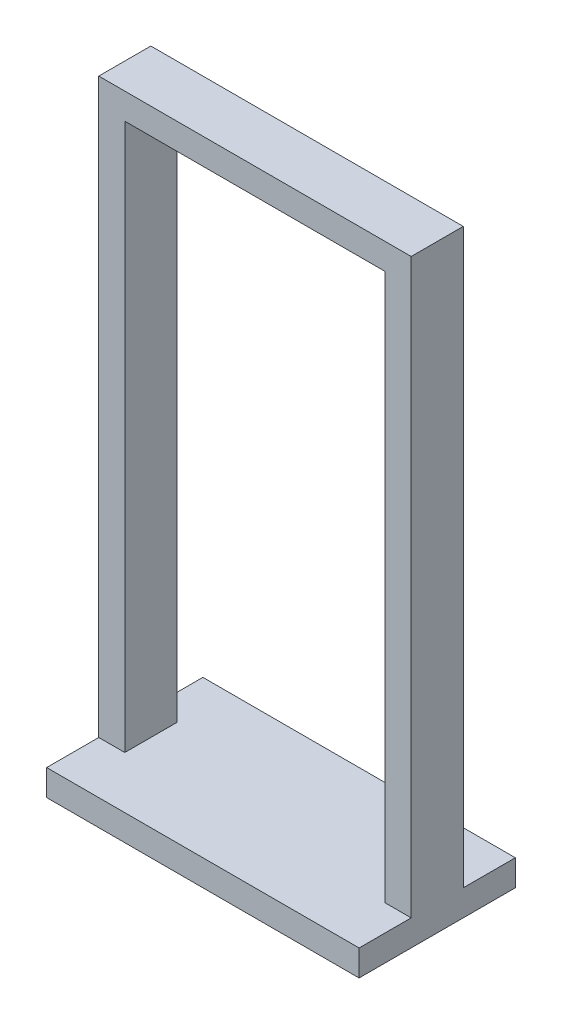
ISO-10303-21;
HEADER;
FILE_DESCRIPTION(('STEP AP214'),'2;1');
FILE_NAME('part.step','',(''),(''),'','','');
FILE_SCHEMA(('AUTOMOTIVE_DESIGN { 1 0 10303 214 1 1 1 1 }'));
ENDSEC;
DATA;
#1=APPLICATION_CONTEXT('core data for automotive mechanical design processes');
#2=APPLICATION_PROTOCOL_DEFINITION('international standard','automotive_design',2000,#1);
#3=PRODUCT_CONTEXT('',#1,'mechanical');
#4=PRODUCT('Part','Part','',(#3));
#5=PRODUCT_RELATED_PRODUCT_CATEGORY('part','',(#4));
#6=PRODUCT_DEFINITION_FORMATION('','',#4);
#7=PRODUCT_DEFINITION_CONTEXT('part definition',#1,'design');
#8=PRODUCT_DEFINITION('design','',#6,#7);
#9=PRODUCT_DEFINITION_SHAPE('','',#8);
#10=(LENGTH_UNIT() NAMED_UNIT(*) SI_UNIT(.MILLI.,.METRE.));
#11=(NAMED_UNIT(*) PLANE_ANGLE_UNIT() SI_UNIT($,.RADIAN.));
#12=(NAMED_UNIT(*) SI_UNIT($,.STERADIAN.) SOLID_ANGLE_UNIT());
#13=UNCERTAINTY_MEASURE_WITH_UNIT(LENGTH_MEASURE(1.E-05),#10,'distance_accuracy_value','');
#14=(GEOMETRIC_REPRESENTATION_CONTEXT(3) GLOBAL_UNCERTAINTY_ASSIGNED_CONTEXT((#13)) GLOBAL_UNIT_ASSIGNED_CONTEXT((#10,
#11,#12)) REPRESENTATION_CONTEXT('',''));
#15=CARTESIAN_POINT('',(0.,0.,0.));
#16=DIRECTION('',(0.,0.,1.));
#17=DIRECTION('',(1.,0.,0.));
#18=AXIS2_PLACEMENT_3D('',#15,#16,#17);
#19=CARTESIAN_POINT('',(-500.,1050.,100.));
#20=DIRECTION('',(0.,-1.,0.));
#21=DIRECTION('',(0.,0.,-1.));
#22=AXIS2_PLACEMENT_3D('',#19,#20,#21);
#23=PLANE('',#22);
#24=DIRECTION('',(-1.,0.,0.));
#25=VECTOR('',#24,1.);
#26=CARTESIAN_POINT('',(-500.,1050.,-100.));
#27=LINE('',#26,#25);
#28=CARTESIAN_POINT('',(500.,1050.,-100.));
#29=VERTEX_POINT('',#28);
#30=CARTESIAN_POINT('',(-500.,1050.,-100.));
#31=VERTEX_POINT('',#30);
#32=EDGE_CURVE('E254',#29,#31,#27,.T.);
#33=ORIENTED_EDGE('',*,*,#32,.F.);
#34=DIRECTION('',(0.,0.,-1.));
#35=VECTOR('',#34,1.);
#36=CARTESIAN_POINT('',(500.,1050.,100.));
#37=LINE('',#36,#35);
#38=CARTESIAN_POINT('',(500.,1050.,100.));
#39=VERTEX_POINT('',#38);
#40=EDGE_CURVE('E266',#39,#29,#37,.T.);
#41=ORIENTED_EDGE('',*,*,#40,.F.);
#42=DIRECTION('',(-1.,0.,0.));
#43=VECTOR('',#42,1.);
#44=CARTESIAN_POINT('',(-500.,1050.,100.));
#45=LINE('',#44,#43);
#46=CARTESIAN_POINT('',(-500.,1050.,100.));
#47=VERTEX_POINT('',#46);
#48=EDGE_CURVE('E244',#39,#47,#45,.T.);
#49=ORIENTED_EDGE('',*,*,#48,.T.);
#50=DIRECTION('',(0.,0.,-1.));
#51=VECTOR('',#50,1.);
#52=CARTESIAN_POINT('',(-500.,1050.,100.));
#53=LINE('',#52,#51);
#54=EDGE_CURVE('E264',#47,#31,#53,.T.);
#55=ORIENTED_EDGE('',*,*,#54,.T.);
#56=EDGE_LOOP('',(#33,#41,#49,#55));
#57=FACE_BOUND('',#56,.T.);
#58=DIRECTION('',(0.,0.,-1.));
#59=VECTOR('',#58,1.);
#60=CARTESIAN_POINT('',(285.,1050.,82.5));
#61=LINE('',#60,#59);
#62=CARTESIAN_POINT('',(285.,1050.,82.5));
#63=VERTEX_POINT('',#62);
#64=CARTESIAN_POINT('',(285.,1050.,65.5));
#65=VERTEX_POINT('',#64);
#66=EDGE_CURVE('E195',#63,#65,#61,.T.);
#67=ORIENTED_EDGE('',*,*,#66,.F.);
#68=DIRECTION('',(1.,0.,0.));
#69=VECTOR('',#68,1.);
#70=CARTESIAN_POINT('',(285.,1050.,82.5));
#71=LINE('',#70,#69);
#72=CARTESIAN_POINT('',(355.,1050.,82.5));
#73=VERTEX_POINT('',#72);
#74=EDGE_CURVE('E80',#63,#73,#71,.T.);
#75=ORIENTED_EDGE('',*,*,#74,.T.);
#76=DIRECTION('',(0.,0.,-1.));
#77=VECTOR('',#76,1.);
#78=CARTESIAN_POINT('',(355.,1050.,82.5));
#79=LINE('',#78,#77);
#80=CARTESIAN_POINT('',(355.,1050.,65.5));
#81=VERTEX_POINT('',#80);
#82=EDGE_CURVE('E199',#73,#81,#79,.T.);
#83=ORIENTED_EDGE('',*,*,#82,.T.);
#84=DIRECTION('',(1.,0.,0.));
#85=VECTOR('',#84,1.);
#86=CARTESIAN_POINT('',(285.,1050.,65.5));
#87=LINE('',#86,#85);
#88=EDGE_CURVE('E521',#65,#81,#87,.T.);
#89=ORIENTED_EDGE('',*,*,#88,.F.);
#90=EDGE_LOOP('',(#67,#75,#83,#89));
#91=FACE_BOUND('',#90,.T.);
#92=ADVANCED_FACE('F65',(#57,#91),#23,.T.);
#93=CARTESIAN_POINT('',(0.,0.,100.));
#94=DIRECTION('',(0.,0.,1.));
#95=DIRECTION('',(1.,0.,0.));
#96=AXIS2_PLACEMENT_3D('',#93,#94,#95);
#97=PLANE('',#96);
#98=DIRECTION('',(-1.,0.,0.));
#99=VECTOR('',#98,1.);
#100=CARTESIAN_POINT('',(1.94289029309402E-13,-1050.,100.));
#101=LINE('',#100,#99);
#102=CARTESIAN_POINT('',(600.,-1050.,100.));
#103=VERTEX_POINT('',#102);
#104=CARTESIAN_POINT('',(500.,-1050.,100.));
#105=VERTEX_POINT('',#104);
#106=EDGE_CURVE('E88',#103,#105,#101,.T.);
#107=ORIENTED_EDGE('',*,*,#106,.F.);
#108=DIRECTION('',(0.,1.,0.));
#109=VECTOR('',#108,1.);
#110=CARTESIAN_POINT('',(600.,0.,100.));
#111=LINE('',#110,#109);
#112=CARTESIAN_POINT('',(600.,1150.,100.));
#113=VERTEX_POINT('',#112);
#114=EDGE_CURVE('E270',#103,#113,#111,.T.);
#115=ORIENTED_EDGE('',*,*,#114,.T.);
#116=DIRECTION('',(-1.,0.,0.));
#117=VECTOR('',#116,1.);
#118=CARTESIAN_POINT('',(0.,1150.,100.));
#119=LINE('',#118,#117);
#120=CARTESIAN_POINT('',(-600.,1150.,100.));
#121=VERTEX_POINT('',#120);
#122=EDGE_CURVE('E272',#113,#121,#119,.T.);
#123=ORIENTED_EDGE('',*,*,#122,.T.);
#124=DIRECTION('',(0.,-1.,0.));
#125=VECTOR('',#124,1.);
#126=CARTESIAN_POINT('',(-600.,0.,100.));
#127=LINE('',#126,#125);
#128=CARTESIAN_POINT('',(-600.,-1050.,100.));
#129=VERTEX_POINT('',#128);
#130=EDGE_CURVE('E275',#121,#129,#127,.T.);
#131=ORIENTED_EDGE('',*,*,#130,.T.);
#132=CARTESIAN_POINT('',(-500.,-1050.,100.));
#133=VERTEX_POINT('',#132);
#134=EDGE_CURVE('E238',#133,#129,#101,.T.);
#135=ORIENTED_EDGE('',*,*,#134,.F.);
#136=DIRECTION('',(0.,-1.,0.));
#137=VECTOR('',#136,1.);
#138=CARTESIAN_POINT('',(-500.,-1050.,100.));
#139=LINE('',#138,#137);
#140=EDGE_CURVE('E247',#47,#133,#139,.T.);
#141=ORIENTED_EDGE('',*,*,#140,.F.);
#142=ORIENTED_EDGE('',*,*,#48,.F.);
#143=DIRECTION('',(0.,1.,0.));
#144=VECTOR('',#143,1.);
#145=CARTESIAN_POINT('',(500.,-1050.,100.));
#146=LINE('',#145,#144);
#147=EDGE_CURVE('E242',#105,#39,#146,.T.);
#148=ORIENTED_EDGE('',*,*,#147,.F.);
#149=EDGE_LOOP('',(#107,#115,#123,#131,#135,#141,#142,#148));
#150=FACE_BOUND('',#149,.T.);
#151=ADVANCED_FACE('F309',(#150),#97,.T.);
#152=CARTESIAN_POINT('',(0.,0.,-100.));
#153=DIRECTION('',(0.,0.,1.));
#154=DIRECTION('',(1.,0.,0.));
#155=AXIS2_PLACEMENT_3D('',#152,#153,#154);
#156=PLANE('',#155);
#157=DIRECTION('',(0.,1.,0.));
#158=VECTOR('',#157,1.);
#159=CARTESIAN_POINT('',(600.,0.,-100.));
#160=LINE('',#159,#158);
#161=CARTESIAN_POINT('',(600.,-1050.,-100.));
#162=VERTEX_POINT('',#161);
#163=CARTESIAN_POINT('',(600.,1150.,-100.));
#164=VERTEX_POINT('',#163);
#165=EDGE_CURVE('E269',#162,#164,#160,.T.);
#166=ORIENTED_EDGE('',*,*,#165,.F.);
#167=DIRECTION('',(-1.,0.,0.));
#168=VECTOR('',#167,1.);
#169=CARTESIAN_POINT('',(1.94289029309402E-13,-1050.,-100.));
#170=LINE('',#169,#168);
#171=CARTESIAN_POINT('',(500.,-1050.,-100.));
#172=VERTEX_POINT('',#171);
#173=EDGE_CURVE('E239',#162,#172,#170,.T.);
#174=ORIENTED_EDGE('',*,*,#173,.T.);
#175=DIRECTION('',(0.,1.,0.));
#176=VECTOR('',#175,1.);
#177=CARTESIAN_POINT('',(500.,-1050.,-100.));
#178=LINE('',#177,#176);
#179=EDGE_CURVE('E251',#172,#29,#178,.T.);
#180=ORIENTED_EDGE('',*,*,#179,.T.);
#181=ORIENTED_EDGE('',*,*,#32,.T.);
#182=DIRECTION('',(0.,-1.,0.));
#183=VECTOR('',#182,1.);
#184=CARTESIAN_POINT('',(-500.,-1050.,-100.));
#185=LINE('',#184,#183);
#186=CARTESIAN_POINT('',(-500.,-1050.,-100.));
#187=VERTEX_POINT('',#186);
#188=EDGE_CURVE('E245',#31,#187,#185,.T.);
#189=ORIENTED_EDGE('',*,*,#188,.T.);
#190=CARTESIAN_POINT('',(-600.,-1050.,-100.));
#191=VERTEX_POINT('',#190);
#192=EDGE_CURVE('E235',#187,#191,#170,.T.);
#193=ORIENTED_EDGE('',*,*,#192,.T.);
#194=DIRECTION('',(0.,-1.,0.));
#195=VECTOR('',#194,1.);
#196=CARTESIAN_POINT('',(-600.,0.,-100.));
#197=LINE('',#196,#195);
#198=CARTESIAN_POINT('',(-600.,1150.,-100.));
#199=VERTEX_POINT('',#198);
#200=EDGE_CURVE('E273',#199,#191,#197,.T.);
#201=ORIENTED_EDGE('',*,*,#200,.F.);
#202=DIRECTION('',(-1.,0.,0.));
#203=VECTOR('',#202,1.);
#204=CARTESIAN_POINT('',(0.,1150.,-100.));
#205=LINE('',#204,#203);
#206=EDGE_CURVE('E279',#164,#199,#205,.T.);
#207=ORIENTED_EDGE('',*,*,#206,.F.);
#208=EDGE_LOOP('',(#166,#174,#180,#181,#189,#193,#201,#207));
#209=FACE_BOUND('',#208,.T.);
#210=ADVANCED_FACE('F298',(#209),#156,.F.);
#211=CARTESIAN_POINT('',(600.,0.,100.));
#212=DIRECTION('',(-1.,0.,0.));
#213=DIRECTION('',(0.,0.,1.));
#214=AXIS2_PLACEMENT_3D('',#211,#212,#213);
#215=PLANE('',#214);
#216=ORIENTED_EDGE('',*,*,#114,.F.);
#217=DIRECTION('',(0.,0.,1.));
#218=VECTOR('',#217,1.);
#219=CARTESIAN_POINT('',(600.,-1050.,-1704.15945787923));
#220=LINE('',#219,#218);
#221=CARTESIAN_POINT('',(600.,-1050.,300.));
#222=VERTEX_POINT('',#221);
#223=EDGE_CURVE('E218',#103,#222,#220,.T.);
#224=ORIENTED_EDGE('',*,*,#223,.T.);
#225=DIRECTION('',(0.,1.,0.));
#226=VECTOR('',#225,1.);
#227=CARTESIAN_POINT('',(600.,-1150.,300.));
#228=LINE('',#227,#226);
#229=CARTESIAN_POINT('',(600.,-1150.,300.));
#230=VERTEX_POINT('',#229);
#231=EDGE_CURVE('E212',#230,#222,#228,.T.);
#232=ORIENTED_EDGE('',*,*,#231,.F.);
#233=DIRECTION('',(0.,0.,-1.));
#234=VECTOR('',#233,1.);
#235=CARTESIAN_POINT('',(600.,-1150.,100.));
#236=LINE('',#235,#234);
#237=CARTESIAN_POINT('',(600.,-1150.,-300.));
#238=VERTEX_POINT('',#237);
#239=EDGE_CURVE('E277',#230,#238,#236,.T.);
#240=ORIENTED_EDGE('',*,*,#239,.T.);
#241=DIRECTION('',(0.,-1.,0.));
#242=VECTOR('',#241,1.);
#243=CARTESIAN_POINT('',(600.,-1150.,-300.));
#244=LINE('',#243,#242);
#245=CARTESIAN_POINT('',(600.,-1050.,-300.));
#246=VERTEX_POINT('',#245);
#247=EDGE_CURVE('E219',#246,#238,#244,.T.);
#248=ORIENTED_EDGE('',*,*,#247,.F.);
#249=EDGE_CURVE('E230',#246,#162,#220,.T.);
#250=ORIENTED_EDGE('',*,*,#249,.T.);
#251=ORIENTED_EDGE('',*,*,#165,.T.);
#252=DIRECTION('',(0.,0.,-1.));
#253=VECTOR('',#252,1.);
#254=CARTESIAN_POINT('',(600.,1150.,100.));
#255=LINE('',#254,#253);
#256=EDGE_CURVE('E13',#113,#164,#255,.T.);
#257=ORIENTED_EDGE('',*,*,#256,.F.);
#258=EDGE_LOOP('',(#216,#224,#232,#240,#248,#250,#251,#257));
#259=FACE_BOUND('',#258,.T.);
#260=ADVANCED_FACE('F67',(#259),#215,.F.);
#261=CARTESIAN_POINT('',(0.,1150.,100.));
#262=DIRECTION('',(0.,-1.,0.));
#263=DIRECTION('',(0.,0.,-1.));
#264=AXIS2_PLACEMENT_3D('',#261,#262,#263);
#265=PLANE('',#264);
#266=ORIENTED_EDGE('',*,*,#206,.T.);
#267=DIRECTION('',(0.,0.,-1.));
#268=VECTOR('',#267,1.);
#269=CARTESIAN_POINT('',(-600.,1150.,100.));
#270=LINE('',#269,#268);
#271=EDGE_CURVE('E73',#121,#199,#270,.T.);
#272=ORIENTED_EDGE('',*,*,#271,.F.);
#273=ORIENTED_EDGE('',*,*,#122,.F.);
#274=ORIENTED_EDGE('',*,*,#256,.T.);
#275=EDGE_LOOP('',(#266,#272,#273,#274));
#276=FACE_BOUND('',#275,.T.);
#277=ADVANCED_FACE('F320',(#276),#265,.F.);
#278=CARTESIAN_POINT('',(-600.,0.,100.));
#279=DIRECTION('',(1.,0.,0.));
#280=DIRECTION('',(0.,0.,-1.));
#281=AXIS2_PLACEMENT_3D('',#278,#279,#280);
#282=PLANE('',#281);
#283=ORIENTED_EDGE('',*,*,#200,.T.);
#284=DIRECTION('',(0.,0.,1.));
#285=VECTOR('',#284,1.);
#286=CARTESIAN_POINT('',(-600.,-1050.,-1704.15945787923));
#287=LINE('',#286,#285);
#288=CARTESIAN_POINT('',(-600.,-1050.,-300.));
#289=VERTEX_POINT('',#288);
#290=EDGE_CURVE('E223',#289,#191,#287,.T.);
#291=ORIENTED_EDGE('',*,*,#290,.F.);
#292=DIRECTION('',(0.,1.,0.));
#293=VECTOR('',#292,1.);
#294=CARTESIAN_POINT('',(-600.,-1150.,-300.));
#295=LINE('',#294,#293);
#296=CARTESIAN_POINT('',(-600.,-1150.,-300.));
#297=VERTEX_POINT('',#296);
#298=EDGE_CURVE('E225',#297,#289,#295,.T.);
#299=ORIENTED_EDGE('',*,*,#298,.F.);
#300=DIRECTION('',(0.,0.,-1.));
#301=VECTOR('',#300,1.);
#302=CARTESIAN_POINT('',(-600.,-1150.,100.));
#303=LINE('',#302,#301);
#304=CARTESIAN_POINT('',(-600.,-1150.,300.));
#305=VERTEX_POINT('',#304);
#306=EDGE_CURVE('E284',#305,#297,#303,.T.);
#307=ORIENTED_EDGE('',*,*,#306,.F.);
#308=DIRECTION('',(0.,-1.,0.));
#309=VECTOR('',#308,1.);
#310=CARTESIAN_POINT('',(-600.,-1150.,300.));
#311=LINE('',#310,#309);
#312=CARTESIAN_POINT('',(-600.,-1050.,300.));
#313=VERTEX_POINT('',#312);
#314=EDGE_CURVE('E200',#313,#305,#311,.T.);
#315=ORIENTED_EDGE('',*,*,#314,.F.);
#316=EDGE_CURVE('E229',#129,#313,#287,.T.);
#317=ORIENTED_EDGE('',*,*,#316,.F.);
#318=ORIENTED_EDGE('',*,*,#130,.F.);
#319=ORIENTED_EDGE('',*,*,#271,.T.);
#320=EDGE_LOOP('',(#283,#291,#299,#307,#315,#317,#318,#319));
#321=FACE_BOUND('',#320,.T.);
#322=ADVANCED_FACE('F290',(#321),#282,.F.);
#323=CARTESIAN_POINT('',(0.,-1150.,100.));
#324=DIRECTION('',(0.,1.,0.));
#325=DIRECTION('',(0.,0.,1.));
#326=AXIS2_PLACEMENT_3D('',#323,#324,#325);
#327=PLANE('',#326);
#328=ORIENTED_EDGE('',*,*,#306,.T.);
#329=DIRECTION('',(-1.,0.,0.));
#330=VECTOR('',#329,1.);
#331=CARTESIAN_POINT('',(-600.,-1150.,-300.));
#332=LINE('',#331,#330);
#333=EDGE_CURVE('E227',#238,#297,#332,.T.);
#334=ORIENTED_EDGE('',*,*,#333,.F.);
#335=ORIENTED_EDGE('',*,*,#239,.F.);
#336=DIRECTION('',(1.,0.,0.));
#337=VECTOR('',#336,1.);
#338=CARTESIAN_POINT('',(-600.,-1150.,300.));
#339=LINE('',#338,#337);
#340=EDGE_CURVE('E204',#305,#230,#339,.T.);
#341=ORIENTED_EDGE('',*,*,#340,.F.);
#342=EDGE_LOOP('',(#328,#334,#335,#341));
#343=FACE_BOUND('',#342,.T.);
#344=ADVANCED_FACE('F326',(#343),#327,.F.);
#345=CARTESIAN_POINT('',(500.,-1050.,100.));
#346=DIRECTION('',(-1.,0.,0.));
#347=DIRECTION('',(0.,0.,1.));
#348=AXIS2_PLACEMENT_3D('',#345,#346,#347);
#349=PLANE('',#348);
#350=ORIENTED_EDGE('',*,*,#179,.F.);
#351=DIRECTION('',(0.,0.,-1.));
#352=VECTOR('',#351,1.);
#353=CARTESIAN_POINT('',(500.,-1050.,100.));
#354=LINE('',#353,#352);
#355=EDGE_CURVE('E250',#105,#172,#354,.T.);
#356=ORIENTED_EDGE('',*,*,#355,.F.);
#357=ORIENTED_EDGE('',*,*,#147,.T.);
#358=ORIENTED_EDGE('',*,*,#40,.T.);
#359=EDGE_LOOP('',(#350,#356,#357,#358));
#360=FACE_BOUND('',#359,.T.);
#361=ADVANCED_FACE('F341',(#360),#349,.T.);
#362=CARTESIAN_POINT('',(-500.,-1050.,100.));
#363=DIRECTION('',(1.,0.,0.));
#364=DIRECTION('',(0.,0.,-1.));
#365=AXIS2_PLACEMENT_3D('',#362,#363,#364);
#366=PLANE('',#365);
#367=ORIENTED_EDGE('',*,*,#188,.F.);
#368=ORIENTED_EDGE('',*,*,#54,.F.);
#369=ORIENTED_EDGE('',*,*,#140,.T.);
#370=DIRECTION('',(0.,0.,-1.));
#371=VECTOR('',#370,1.);
#372=CARTESIAN_POINT('',(-500.,-1050.,100.));
#373=LINE('',#372,#371);
#374=EDGE_CURVE('E261',#133,#187,#373,.T.);
#375=ORIENTED_EDGE('',*,*,#374,.T.);
#376=EDGE_LOOP('',(#367,#368,#369,#375));
#377=FACE_BOUND('',#376,.T.);
#378=ADVANCED_FACE('F305',(#377),#366,.T.);
#379=CARTESIAN_POINT('',(-500.,-1050.,100.));
#380=DIRECTION('',(0.,1.,0.));
#381=DIRECTION('',(0.,0.,1.));
#382=AXIS2_PLACEMENT_3D('',#379,#380,#381);
#383=PLANE('',#382);
#384=ORIENTED_EDGE('',*,*,#355,.T.);
#385=ORIENTED_EDGE('',*,*,#173,.F.);
#386=ORIENTED_EDGE('',*,*,#249,.F.);
#387=DIRECTION('',(1.,0.,0.));
#388=VECTOR('',#387,1.);
#389=CARTESIAN_POINT('',(-600.,-1050.,-300.));
#390=LINE('',#389,#388);
#391=EDGE_CURVE('E222',#289,#246,#390,.T.);
#392=ORIENTED_EDGE('',*,*,#391,.F.);
#393=ORIENTED_EDGE('',*,*,#290,.T.);
#394=ORIENTED_EDGE('',*,*,#192,.F.);
#395=ORIENTED_EDGE('',*,*,#374,.F.);
#396=ORIENTED_EDGE('',*,*,#134,.T.);
#397=ORIENTED_EDGE('',*,*,#316,.T.);
#398=DIRECTION('',(-1.,0.,0.));
#399=VECTOR('',#398,1.);
#400=CARTESIAN_POINT('',(-600.,-1050.,300.));
#401=LINE('',#400,#399);
#402=EDGE_CURVE('E215',#222,#313,#401,.T.);
#403=ORIENTED_EDGE('',*,*,#402,.F.);
#404=ORIENTED_EDGE('',*,*,#223,.F.);
#405=ORIENTED_EDGE('',*,*,#106,.T.);
#406=EDGE_LOOP('',(#384,#385,#386,#392,#393,#394,#395,#396,#397,#403,#404,#405));
#407=FACE_BOUND('',#406,.T.);
#408=ADVANCED_FACE('F302',(#407),#383,.T.);
#409=CARTESIAN_POINT('',(0.,0.,-300.));
#410=DIRECTION('',(0.,0.,1.));
#411=DIRECTION('',(1.,0.,0.));
#412=AXIS2_PLACEMENT_3D('',#409,#410,#411);
#413=PLANE('',#412);
#414=ORIENTED_EDGE('',*,*,#298,.T.);
#415=ORIENTED_EDGE('',*,*,#391,.T.);
#416=ORIENTED_EDGE('',*,*,#247,.T.);
#417=ORIENTED_EDGE('',*,*,#333,.T.);
#418=EDGE_LOOP('',(#414,#415,#416,#417));
#419=FACE_BOUND('',#418,.T.);
#420=ADVANCED_FACE('F353',(#419),#413,.F.);
#421=CARTESIAN_POINT('',(0.,0.,300.));
#422=DIRECTION('',(0.,0.,-1.));
#423=DIRECTION('',(-1.,0.,0.));
#424=AXIS2_PLACEMENT_3D('',#421,#422,#423);
#425=PLANE('',#424);
#426=ORIENTED_EDGE('',*,*,#314,.T.);
#427=ORIENTED_EDGE('',*,*,#340,.T.);
#428=ORIENTED_EDGE('',*,*,#231,.T.);
#429=ORIENTED_EDGE('',*,*,#402,.T.);
#430=EDGE_LOOP('',(#426,#427,#428,#429));
#431=FACE_BOUND('',#430,.T.);
#432=ADVANCED_FACE('F315',(#431),#425,.F.);
#433=CARTESIAN_POINT('',(285.,1080.,82.5));
#434=DIRECTION('',(0.,0.,-1.));
#435=DIRECTION('',(-1.,0.,0.));
#436=AXIS2_PLACEMENT_3D('',#433,#434,#435);
#437=PLANE('',#436);
#438=ORIENTED_EDGE('',*,*,#74,.F.);
#439=DIRECTION('',(0.,-1.,0.));
#440=VECTOR('',#439,1.);
#441=CARTESIAN_POINT('',(285.,1080.,82.5));
#442=LINE('',#441,#440);
#443=CARTESIAN_POINT('',(285.,1080.,82.5));
#444=VERTEX_POINT('',#443);
#445=EDGE_CURVE('E194',#444,#63,#442,.T.);
#446=ORIENTED_EDGE('',*,*,#445,.F.);
#447=DIRECTION('',(1.,0.,0.));
#448=VECTOR('',#447,1.);
#449=CARTESIAN_POINT('',(285.,1080.,82.5));
#450=LINE('',#449,#448);
#451=CARTESIAN_POINT('',(355.,1080.,82.5));
#452=VERTEX_POINT('',#451);
#453=EDGE_CURVE('E184',#444,#452,#450,.T.);
#454=ORIENTED_EDGE('',*,*,#453,.T.);
#455=DIRECTION('',(0.,-1.,0.));
#456=VECTOR('',#455,1.);
#457=CARTESIAN_POINT('',(355.,1080.,82.5));
#458=LINE('',#457,#456);
#459=EDGE_CURVE('E193',#452,#73,#458,.T.);
#460=ORIENTED_EDGE('',*,*,#459,.T.);
#461=EDGE_LOOP('',(#438,#446,#454,#460));
#462=FACE_BOUND('',#461,.T.);
#463=ADVANCED_FACE('F192',(#462),#437,.T.);
#464=CARTESIAN_POINT('',(355.,1080.,82.5));
#465=DIRECTION('',(-1.,0.,0.));
#466=DIRECTION('',(0.,0.,1.));
#467=AXIS2_PLACEMENT_3D('',#464,#465,#466);
#468=PLANE('',#467);
#469=ORIENTED_EDGE('',*,*,#82,.F.);
#470=ORIENTED_EDGE('',*,*,#459,.F.);
#471=DIRECTION('',(0.,0.,-1.));
#472=VECTOR('',#471,1.);
#473=CARTESIAN_POINT('',(355.,1080.,82.5));
#474=LINE('',#473,#472);
#475=CARTESIAN_POINT('',(355.,1080.,65.5));
#476=VERTEX_POINT('',#475);
#477=EDGE_CURVE('E180',#452,#476,#474,.T.);
#478=ORIENTED_EDGE('',*,*,#477,.T.);
#479=DIRECTION('',(0.,-1.,0.));
#480=VECTOR('',#479,1.);
#481=CARTESIAN_POINT('',(355.,1080.,65.5));
#482=LINE('',#481,#480);
#483=EDGE_CURVE('E201',#476,#81,#482,.T.);
#484=ORIENTED_EDGE('',*,*,#483,.T.);
#485=EDGE_LOOP('',(#469,#470,#478,#484));
#486=FACE_BOUND('',#485,.T.);
#487=ADVANCED_FACE('F197',(#486),#468,.T.);
#488=CARTESIAN_POINT('',(285.,1080.,65.5));
#489=DIRECTION('',(0.,0.,-1.));
#490=DIRECTION('',(-1.,0.,0.));
#491=AXIS2_PLACEMENT_3D('',#488,#489,#490);
#492=PLANE('',#491);
#493=ORIENTED_EDGE('',*,*,#88,.T.);
#494=ORIENTED_EDGE('',*,*,#483,.F.);
#495=DIRECTION('',(1.,0.,0.));
#496=VECTOR('',#495,1.);
#497=CARTESIAN_POINT('',(285.,1080.,65.5));
#498=LINE('',#497,#496);
#499=CARTESIAN_POINT('',(285.,1080.,65.5));
#500=VERTEX_POINT('',#499);
#501=EDGE_CURVE('E187',#500,#476,#498,.T.);
#502=ORIENTED_EDGE('',*,*,#501,.F.);
#503=DIRECTION('',(0.,-1.,0.));
#504=VECTOR('',#503,1.);
#505=CARTESIAN_POINT('',(285.,1080.,65.5));
#506=LINE('',#505,#504);
#507=EDGE_CURVE('E206',#500,#65,#506,.T.);
#508=ORIENTED_EDGE('',*,*,#507,.T.);
#509=EDGE_LOOP('',(#493,#494,#502,#508));
#510=FACE_BOUND('',#509,.T.);
#511=ADVANCED_FACE('F370',(#510),#492,.F.);
#512=CARTESIAN_POINT('',(285.,1080.,82.5));
#513=DIRECTION('',(-1.,0.,0.));
#514=DIRECTION('',(0.,0.,1.));
#515=AXIS2_PLACEMENT_3D('',#512,#513,#514);
#516=PLANE('',#515);
#517=ORIENTED_EDGE('',*,*,#66,.T.);
#518=ORIENTED_EDGE('',*,*,#507,.F.);
#519=DIRECTION('',(0.,0.,-1.));
#520=VECTOR('',#519,1.);
#521=CARTESIAN_POINT('',(285.,1080.,82.5));
#522=LINE('',#521,#520);
#523=EDGE_CURVE('E528',#444,#500,#522,.T.);
#524=ORIENTED_EDGE('',*,*,#523,.F.);
#525=ORIENTED_EDGE('',*,*,#445,.T.);
#526=EDGE_LOOP('',(#517,#518,#524,#525));
#527=FACE_BOUND('',#526,.T.);
#528=ADVANCED_FACE('F373',(#527),#516,.F.);
#529=CARTESIAN_POINT('',(0.,1080.,0.));
#530=DIRECTION('',(0.,1.,0.));
#531=DIRECTION('',(0.,0.,1.));
#532=AXIS2_PLACEMENT_3D('',#529,#530,#531);
#533=PLANE('',#532);
#534=ORIENTED_EDGE('',*,*,#453,.F.);
#535=ORIENTED_EDGE('',*,*,#523,.T.);
#536=ORIENTED_EDGE('',*,*,#501,.T.);
#537=ORIENTED_EDGE('',*,*,#477,.F.);
#538=EDGE_LOOP('',(#534,#535,#536,#537));
#539=FACE_BOUND('',#538,.T.);
#540=ADVANCED_FACE('F182',(#539),#533,.F.);
#541=CLOSED_SHELL('',(#92,#151,#210,#260,#277,#322,#344,#361,#378,#408,#420,#432,#463,#487,#511,
#528,#540));
#542=MANIFOLD_SOLID_BREP('B2',#541);
#543=ADVANCED_BREP_SHAPE_REPRESENTATION('',(#18,#542),#14);
#544=SHAPE_DEFINITION_REPRESENTATION(#9,#543);
ENDSEC;
END-ISO-10303-21;
